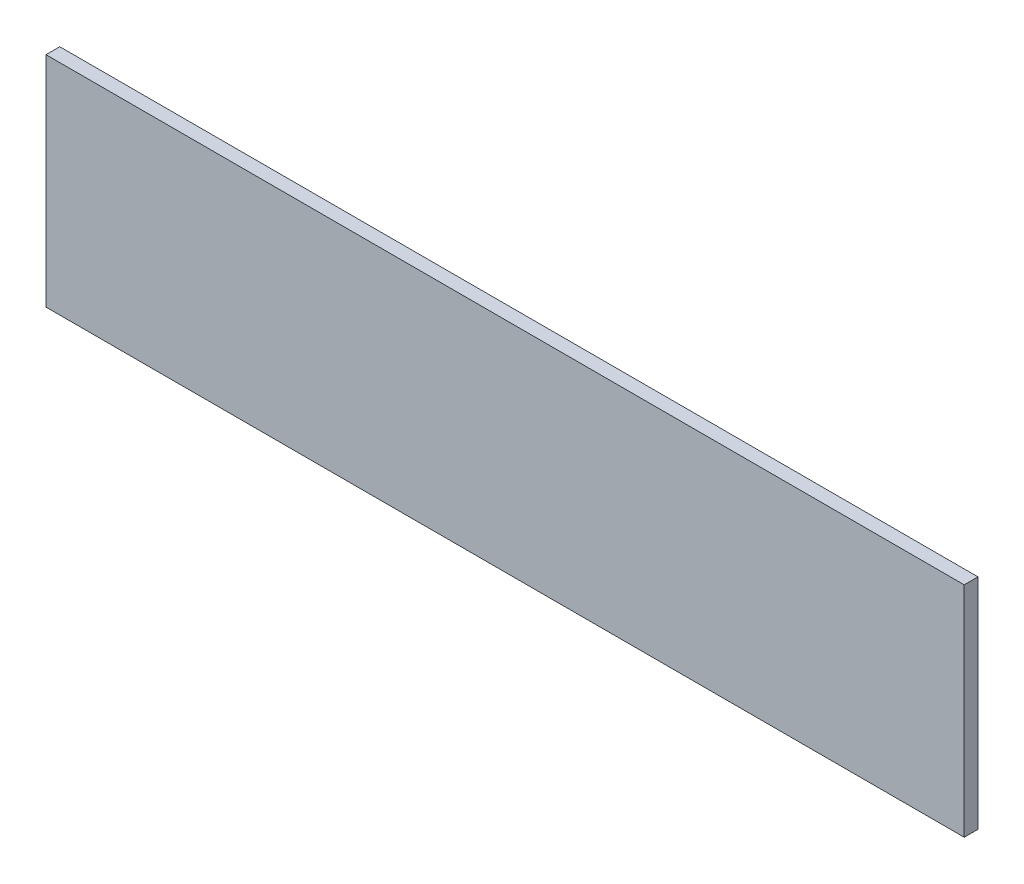
ISO-10303-21;
HEADER;
FILE_DESCRIPTION(('STEP AP214'),'2;1');
FILE_NAME('part.step','',(''),(''),'','','');
FILE_SCHEMA(('AUTOMOTIVE_DESIGN { 1 0 10303 214 1 1 1 1 }'));
ENDSEC;
DATA;
#1=APPLICATION_CONTEXT('core data for automotive mechanical design processes');
#2=APPLICATION_PROTOCOL_DEFINITION('international standard','automotive_design',2000,#1);
#3=PRODUCT_CONTEXT('',#1,'mechanical');
#4=PRODUCT('Part','Part','',(#3));
#5=PRODUCT_RELATED_PRODUCT_CATEGORY('part','',(#4));
#6=PRODUCT_DEFINITION_FORMATION('','',#4);
#7=PRODUCT_DEFINITION_CONTEXT('part definition',#1,'design');
#8=PRODUCT_DEFINITION('design','',#6,#7);
#9=PRODUCT_DEFINITION_SHAPE('','',#8);
#10=(LENGTH_UNIT() NAMED_UNIT(*) SI_UNIT(.MILLI.,.METRE.));
#11=(NAMED_UNIT(*) PLANE_ANGLE_UNIT() SI_UNIT($,.RADIAN.));
#12=(NAMED_UNIT(*) SI_UNIT($,.STERADIAN.) SOLID_ANGLE_UNIT());
#13=UNCERTAINTY_MEASURE_WITH_UNIT(LENGTH_MEASURE(1.E-05),#10,'distance_accuracy_value','');
#14=(GEOMETRIC_REPRESENTATION_CONTEXT(3) GLOBAL_UNCERTAINTY_ASSIGNED_CONTEXT((#13)) GLOBAL_UNIT_ASSIGNED_CONTEXT((#10,
#11,#12)) REPRESENTATION_CONTEXT('',''));
#15=CARTESIAN_POINT('',(0.,0.,0.));
#16=DIRECTION('',(0.,0.,1.));
#17=DIRECTION('',(1.,0.,0.));
#18=AXIS2_PLACEMENT_3D('',#15,#16,#17);
#19=CARTESIAN_POINT('',(53.34,-12.7,1.6));
#20=DIRECTION('',(-1.,0.,0.));
#21=DIRECTION('',(0.,0.,1.));
#22=AXIS2_PLACEMENT_3D('',#19,#20,#21);
#23=PLANE('',#22);
#24=DIRECTION('',(0.,1.,0.));
#25=VECTOR('',#24,1.);
#26=CARTESIAN_POINT('',(53.34,-12.7,0.));
#27=LINE('',#26,#25);
#28=CARTESIAN_POINT('',(53.34,-12.7,0.));
#29=VERTEX_POINT('',#28);
#30=CARTESIAN_POINT('',(53.34,12.7,0.));
#31=VERTEX_POINT('',#30);
#32=EDGE_CURVE('E107',#29,#31,#27,.T.);
#33=ORIENTED_EDGE('',*,*,#32,.T.);
#34=DIRECTION('',(0.,0.,-1.));
#35=VECTOR('',#34,1.);
#36=CARTESIAN_POINT('',(53.34,12.7,1.6));
#37=LINE('',#36,#35);
#38=CARTESIAN_POINT('',(53.34,12.7,1.6));
#39=VERTEX_POINT('',#38);
#40=EDGE_CURVE('E11',#39,#31,#37,.T.);
#41=ORIENTED_EDGE('',*,*,#40,.F.);
#42=DIRECTION('',(0.,1.,0.));
#43=VECTOR('',#42,1.);
#44=CARTESIAN_POINT('',(53.34,-12.7,1.6));
#45=LINE('',#44,#43);
#46=CARTESIAN_POINT('',(53.34,-12.7,1.6));
#47=VERTEX_POINT('',#46);
#48=EDGE_CURVE('E91',#47,#39,#45,.T.);
#49=ORIENTED_EDGE('',*,*,#48,.F.);
#50=DIRECTION('',(0.,0.,-1.));
#51=VECTOR('',#50,1.);
#52=CARTESIAN_POINT('',(53.34,-12.7,1.6));
#53=LINE('',#52,#51);
#54=EDGE_CURVE('E103',#47,#29,#53,.T.);
#55=ORIENTED_EDGE('',*,*,#54,.T.);
#56=EDGE_LOOP('',(#33,#41,#49,#55));
#57=FACE_BOUND('',#56,.T.);
#58=ADVANCED_FACE('F39',(#57),#23,.F.);
#59=CARTESIAN_POINT('',(-53.34,12.7,1.6));
#60=DIRECTION('',(0.,-1.,0.));
#61=DIRECTION('',(0.,0.,-1.));
#62=AXIS2_PLACEMENT_3D('',#59,#60,#61);
#63=PLANE('',#62);
#64=DIRECTION('',(-1.,0.,0.));
#65=VECTOR('',#64,1.);
#66=CARTESIAN_POINT('',(-53.34,12.7,0.));
#67=LINE('',#66,#65);
#68=CARTESIAN_POINT('',(-53.34,12.7,0.));
#69=VERTEX_POINT('',#68);
#70=EDGE_CURVE('E96',#31,#69,#67,.T.);
#71=ORIENTED_EDGE('',*,*,#70,.T.);
#72=DIRECTION('',(0.,0.,-1.));
#73=VECTOR('',#72,1.);
#74=CARTESIAN_POINT('',(-53.34,12.7,1.6));
#75=LINE('',#74,#73);
#76=CARTESIAN_POINT('',(-53.34,12.7,1.6));
#77=VERTEX_POINT('',#76);
#78=EDGE_CURVE('E48',#77,#69,#75,.T.);
#79=ORIENTED_EDGE('',*,*,#78,.F.);
#80=DIRECTION('',(-1.,0.,0.));
#81=VECTOR('',#80,1.);
#82=CARTESIAN_POINT('',(-53.34,12.7,1.6));
#83=LINE('',#82,#81);
#84=EDGE_CURVE('E86',#39,#77,#83,.T.);
#85=ORIENTED_EDGE('',*,*,#84,.F.);
#86=ORIENTED_EDGE('',*,*,#40,.T.);
#87=EDGE_LOOP('',(#71,#79,#85,#86));
#88=FACE_BOUND('',#87,.T.);
#89=ADVANCED_FACE('F95',(#88),#63,.F.);
#90=CARTESIAN_POINT('',(-53.34,-12.7,1.6));
#91=DIRECTION('',(1.,0.,0.));
#92=DIRECTION('',(0.,0.,-1.));
#93=AXIS2_PLACEMENT_3D('',#90,#91,#92);
#94=PLANE('',#93);
#95=DIRECTION('',(0.,-1.,0.));
#96=VECTOR('',#95,1.);
#97=CARTESIAN_POINT('',(-53.34,-12.7,0.));
#98=LINE('',#97,#96);
#99=CARTESIAN_POINT('',(-53.34,-12.7,0.));
#100=VERTEX_POINT('',#99);
#101=EDGE_CURVE('E73',#69,#100,#98,.T.);
#102=ORIENTED_EDGE('',*,*,#101,.T.);
#103=DIRECTION('',(0.,0.,-1.));
#104=VECTOR('',#103,1.);
#105=CARTESIAN_POINT('',(-53.34,-12.7,1.6));
#106=LINE('',#105,#104);
#107=CARTESIAN_POINT('',(-53.34,-12.7,1.6));
#108=VERTEX_POINT('',#107);
#109=EDGE_CURVE('E98',#108,#100,#106,.T.);
#110=ORIENTED_EDGE('',*,*,#109,.F.);
#111=DIRECTION('',(0.,-1.,0.));
#112=VECTOR('',#111,1.);
#113=CARTESIAN_POINT('',(-53.34,-12.7,1.6));
#114=LINE('',#113,#112);
#115=EDGE_CURVE('E89',#77,#108,#114,.T.);
#116=ORIENTED_EDGE('',*,*,#115,.F.);
#117=ORIENTED_EDGE('',*,*,#78,.T.);
#118=EDGE_LOOP('',(#102,#110,#116,#117));
#119=FACE_BOUND('',#118,.T.);
#120=ADVANCED_FACE('F99',(#119),#94,.F.);
#121=CARTESIAN_POINT('',(-53.34,-12.7,1.6));
#122=DIRECTION('',(0.,1.,0.));
#123=DIRECTION('',(0.,0.,1.));
#124=AXIS2_PLACEMENT_3D('',#121,#122,#123);
#125=PLANE('',#124);
#126=DIRECTION('',(1.,0.,0.));
#127=VECTOR('',#126,1.);
#128=CARTESIAN_POINT('',(-53.34,-12.7,0.));
#129=LINE('',#128,#127);
#130=EDGE_CURVE('E79',#100,#29,#129,.T.);
#131=ORIENTED_EDGE('',*,*,#130,.T.);
#132=ORIENTED_EDGE('',*,*,#54,.F.);
#133=DIRECTION('',(1.,0.,0.));
#134=VECTOR('',#133,1.);
#135=CARTESIAN_POINT('',(-53.34,-12.7,1.6));
#136=LINE('',#135,#134);
#137=EDGE_CURVE('E56',#108,#47,#136,.T.);
#138=ORIENTED_EDGE('',*,*,#137,.F.);
#139=ORIENTED_EDGE('',*,*,#109,.T.);
#140=EDGE_LOOP('',(#131,#132,#138,#139));
#141=FACE_BOUND('',#140,.T.);
#142=ADVANCED_FACE('F120',(#141),#125,.F.);
#143=CARTESIAN_POINT('',(0.,0.,1.6));
#144=DIRECTION('',(0.,0.,-1.));
#145=DIRECTION('',(-1.,0.,0.));
#146=AXIS2_PLACEMENT_3D('',#143,#144,#145);
#147=PLANE('',#146);
#148=ORIENTED_EDGE('',*,*,#48,.T.);
#149=ORIENTED_EDGE('',*,*,#84,.T.);
#150=ORIENTED_EDGE('',*,*,#115,.T.);
#151=ORIENTED_EDGE('',*,*,#137,.T.);
#152=EDGE_LOOP('',(#148,#149,#150,#151));
#153=FACE_BOUND('',#152,.T.);
#154=ADVANCED_FACE('F87',(#153),#147,.F.);
#155=CARTESIAN_POINT('',(0.,0.,0.));
#156=DIRECTION('',(0.,0.,-1.));
#157=DIRECTION('',(-1.,0.,0.));
#158=AXIS2_PLACEMENT_3D('',#155,#156,#157);
#159=PLANE('',#158);
#160=ORIENTED_EDGE('',*,*,#32,.F.);
#161=ORIENTED_EDGE('',*,*,#130,.F.);
#162=ORIENTED_EDGE('',*,*,#101,.F.);
#163=ORIENTED_EDGE('',*,*,#70,.F.);
#164=EDGE_LOOP('',(#160,#161,#162,#163));
#165=FACE_BOUND('',#164,.T.);
#166=ADVANCED_FACE('F123',(#165),#159,.T.);
#167=CLOSED_SHELL('',(#58,#89,#120,#142,#154,#166));
#168=MANIFOLD_SOLID_BREP('B2',#167);
#169=ADVANCED_BREP_SHAPE_REPRESENTATION('',(#18,#168),#14);
#170=SHAPE_DEFINITION_REPRESENTATION(#9,#169);
ENDSEC;
END-ISO-10303-21;
